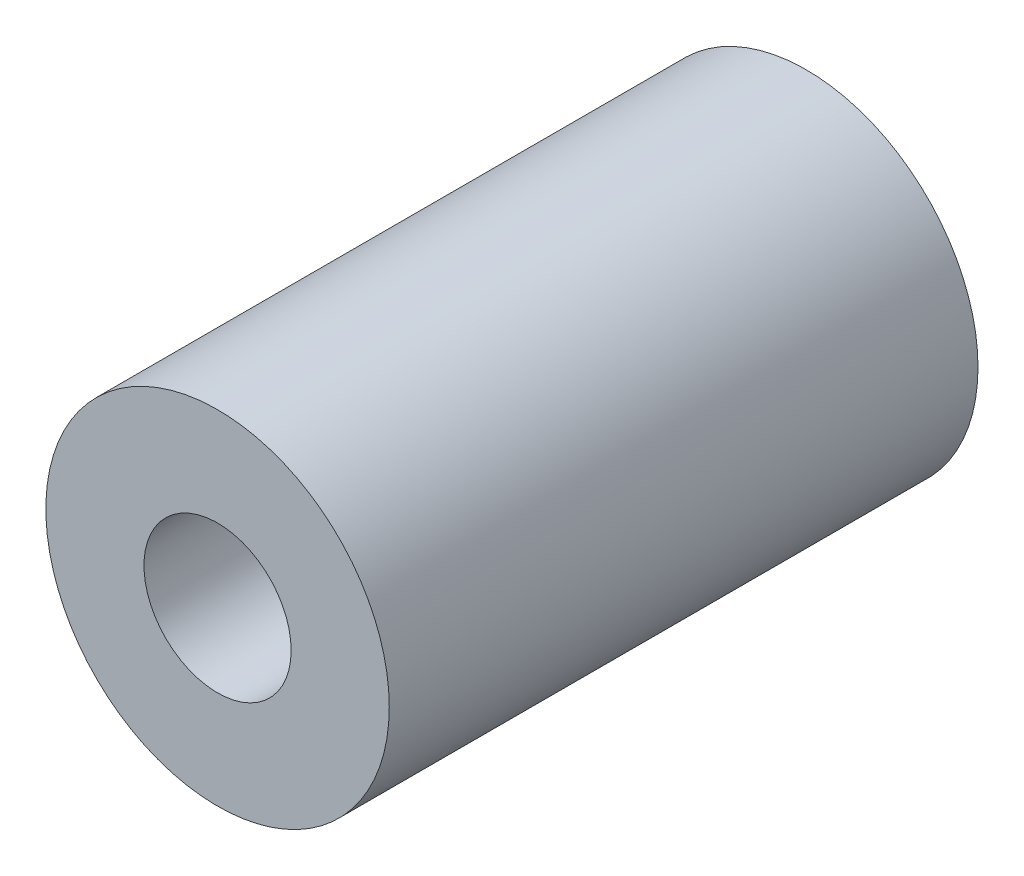
ISO-10303-21;
HEADER;
FILE_DESCRIPTION(('STEP AP214'),'2;1');
FILE_NAME('part.step','',(''),(''),'','','');
FILE_SCHEMA(('AUTOMOTIVE_DESIGN { 1 0 10303 214 1 1 1 1 }'));
ENDSEC;
DATA;
#1=APPLICATION_CONTEXT('core data for automotive mechanical design processes');
#2=APPLICATION_PROTOCOL_DEFINITION('international standard','automotive_design',2000,#1);
#3=PRODUCT_CONTEXT('',#1,'mechanical');
#4=PRODUCT('Part','Part','',(#3));
#5=PRODUCT_RELATED_PRODUCT_CATEGORY('part','',(#4));
#6=PRODUCT_DEFINITION_FORMATION('','',#4);
#7=PRODUCT_DEFINITION_CONTEXT('part definition',#1,'design');
#8=PRODUCT_DEFINITION('design','',#6,#7);
#9=PRODUCT_DEFINITION_SHAPE('','',#8);
#10=(LENGTH_UNIT() NAMED_UNIT(*) SI_UNIT(.MILLI.,.METRE.));
#11=(NAMED_UNIT(*) PLANE_ANGLE_UNIT() SI_UNIT($,.RADIAN.));
#12=(NAMED_UNIT(*) SI_UNIT($,.STERADIAN.) SOLID_ANGLE_UNIT());
#13=UNCERTAINTY_MEASURE_WITH_UNIT(LENGTH_MEASURE(1.E-05),#10,'distance_accuracy_value','');
#14=(GEOMETRIC_REPRESENTATION_CONTEXT(3) GLOBAL_UNCERTAINTY_ASSIGNED_CONTEXT((#13)) GLOBAL_UNIT_ASSIGNED_CONTEXT((#10,
#11,#12)) REPRESENTATION_CONTEXT('',''));
#15=CARTESIAN_POINT('',(0.,0.,0.));
#16=DIRECTION('',(0.,0.,1.));
#17=DIRECTION('',(1.,0.,0.));
#18=AXIS2_PLACEMENT_3D('',#15,#16,#17);
#19=CARTESIAN_POINT('',(0.,0.,12.));
#20=DIRECTION('',(0.,0.,1.));
#21=DIRECTION('',(1.,0.,0.));
#22=AXIS2_PLACEMENT_3D('',#19,#20,#21);
#23=PLANE('',#22);
#24=CARTESIAN_POINT('',(0.,0.,12.));
#25=DIRECTION('',(0.,0.,1.));
#26=DIRECTION('',(1.,0.,0.));
#27=AXIS2_PLACEMENT_3D('',#24,#25,#26);
#28=CIRCLE('',#27,3.5);
#29=CARTESIAN_POINT('',(3.5,0.,12.));
#30=VERTEX_POINT('',#29);
#31=EDGE_CURVE('E10',#30,#30,#28,.T.);
#32=ORIENTED_EDGE('',*,*,#31,.T.);
#33=EDGE_LOOP('',(#32));
#34=FACE_BOUND('',#33,.T.);
#35=CARTESIAN_POINT('',(0.,0.,12.));
#36=DIRECTION('',(0.,0.,1.));
#37=DIRECTION('',(1.,0.,0.));
#38=AXIS2_PLACEMENT_3D('',#35,#36,#37);
#39=CIRCLE('',#38,1.5);
#40=CARTESIAN_POINT('',(1.5,0.,12.));
#41=VERTEX_POINT('',#40);
#42=EDGE_CURVE('E43',#41,#41,#39,.T.);
#43=ORIENTED_EDGE('',*,*,#42,.F.);
#44=EDGE_LOOP('',(#43));
#45=FACE_BOUND('',#44,.T.);
#46=ADVANCED_FACE('F32',(#34,#45),#23,.T.);
#47=CARTESIAN_POINT('',(0.,0.,0.));
#48=DIRECTION('',(0.,0.,1.));
#49=DIRECTION('',(1.,0.,0.));
#50=AXIS2_PLACEMENT_3D('',#47,#48,#49);
#51=PLANE('',#50);
#52=CARTESIAN_POINT('',(0.,0.,0.));
#53=DIRECTION('',(0.,0.,1.));
#54=DIRECTION('',(1.,0.,0.));
#55=AXIS2_PLACEMENT_3D('',#52,#53,#54);
#56=CIRCLE('',#55,3.5);
#57=CARTESIAN_POINT('',(3.5,0.,0.));
#58=VERTEX_POINT('',#57);
#59=EDGE_CURVE('E36',#58,#58,#56,.T.);
#60=ORIENTED_EDGE('',*,*,#59,.F.);
#61=EDGE_LOOP('',(#60));
#62=FACE_BOUND('',#61,.T.);
#63=CARTESIAN_POINT('',(0.,0.,0.));
#64=DIRECTION('',(0.,0.,1.));
#65=DIRECTION('',(1.,0.,0.));
#66=AXIS2_PLACEMENT_3D('',#63,#64,#65);
#67=CIRCLE('',#66,1.5);
#68=CARTESIAN_POINT('',(1.5,0.,0.));
#69=VERTEX_POINT('',#68);
#70=EDGE_CURVE('E45',#69,#69,#67,.T.);
#71=ORIENTED_EDGE('',*,*,#70,.T.);
#72=EDGE_LOOP('',(#71));
#73=FACE_BOUND('',#72,.T.);
#74=ADVANCED_FACE('F55',(#62,#73),#51,.F.);
#75=CARTESIAN_POINT('',(0.,0.,12.));
#76=DIRECTION('',(0.,0.,-1.));
#77=DIRECTION('',(-1.,0.,0.));
#78=AXIS2_PLACEMENT_3D('',#75,#76,#77);
#79=CYLINDRICAL_SURFACE('',#78,3.5);
#80=ORIENTED_EDGE('',*,*,#31,.F.);
#81=EDGE_LOOP('',(#80));
#82=FACE_BOUND('',#81,.T.);
#83=ORIENTED_EDGE('',*,*,#59,.T.);
#84=EDGE_LOOP('',(#83));
#85=FACE_BOUND('',#84,.T.);
#86=ADVANCED_FACE('F34',(#82,#85),#79,.T.);
#87=CARTESIAN_POINT('',(0.,0.,12.));
#88=DIRECTION('',(0.,0.,-1.));
#89=DIRECTION('',(-1.,0.,0.));
#90=AXIS2_PLACEMENT_3D('',#87,#88,#89);
#91=CYLINDRICAL_SURFACE('',#90,1.5);
#92=ORIENTED_EDGE('',*,*,#42,.T.);
#93=EDGE_LOOP('',(#92));
#94=FACE_BOUND('',#93,.T.);
#95=ORIENTED_EDGE('',*,*,#70,.F.);
#96=EDGE_LOOP('',(#95));
#97=FACE_BOUND('',#96,.T.);
#98=ADVANCED_FACE('F51',(#94,#97),#91,.F.);
#99=CLOSED_SHELL('',(#46,#74,#86,#98));
#100=MANIFOLD_SOLID_BREP('B2',#99);
#101=ADVANCED_BREP_SHAPE_REPRESENTATION('',(#18,#100),#14);
#102=SHAPE_DEFINITION_REPRESENTATION(#9,#101);
ENDSEC;
END-ISO-10303-21;
